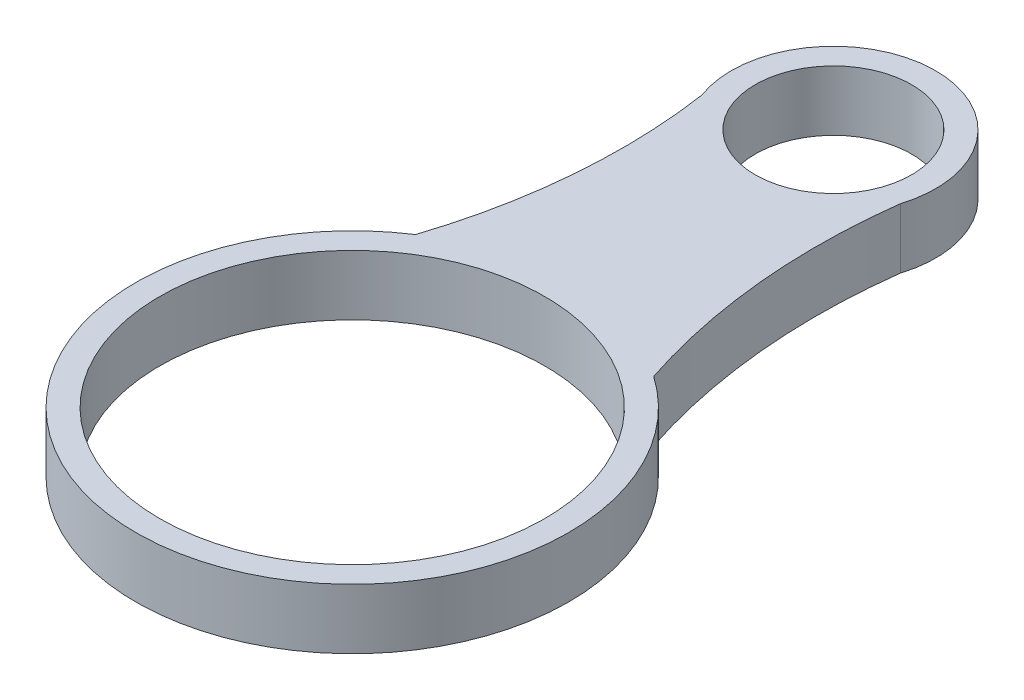
ISO-10303-21;
HEADER;
FILE_DESCRIPTION(('STEP AP214'),'2;1');
FILE_NAME('part.step','',(''),(''),'','','');
FILE_SCHEMA(('AUTOMOTIVE_DESIGN { 1 0 10303 214 1 1 1 1 }'));
ENDSEC;
DATA;
#1=APPLICATION_CONTEXT('core data for automotive mechanical design processes');
#2=APPLICATION_PROTOCOL_DEFINITION('international standard','automotive_design',2000,#1);
#3=PRODUCT_CONTEXT('',#1,'mechanical');
#4=PRODUCT('Part','Part','',(#3));
#5=PRODUCT_RELATED_PRODUCT_CATEGORY('part','',(#4));
#6=PRODUCT_DEFINITION_FORMATION('','',#4);
#7=PRODUCT_DEFINITION_CONTEXT('part definition',#1,'design');
#8=PRODUCT_DEFINITION('design','',#6,#7);
#9=PRODUCT_DEFINITION_SHAPE('','',#8);
#10=(LENGTH_UNIT() NAMED_UNIT(*) SI_UNIT(.MILLI.,.METRE.));
#11=(NAMED_UNIT(*) PLANE_ANGLE_UNIT() SI_UNIT($,.RADIAN.));
#12=(NAMED_UNIT(*) SI_UNIT($,.STERADIAN.) SOLID_ANGLE_UNIT());
#13=UNCERTAINTY_MEASURE_WITH_UNIT(LENGTH_MEASURE(1.E-05),#10,'distance_accuracy_value','');
#14=(GEOMETRIC_REPRESENTATION_CONTEXT(3) GLOBAL_UNCERTAINTY_ASSIGNED_CONTEXT((#13)) GLOBAL_UNIT_ASSIGNED_CONTEXT((#10,
#11,#12)) REPRESENTATION_CONTEXT('',''));
#15=CARTESIAN_POINT('',(0.,0.,0.));
#16=DIRECTION('',(0.,0.,1.));
#17=DIRECTION('',(1.,0.,0.));
#18=AXIS2_PLACEMENT_3D('',#15,#16,#17);
#19=CARTESIAN_POINT('',(-553.271398167684,50.,100.066792935175));
#20=DIRECTION('',(0.,-1.,0.));
#21=DIRECTION('',(0.,0.,-1.));
#22=AXIS2_PLACEMENT_3D('',#19,#20,#21);
#23=CYLINDRICAL_SURFACE('',#22,478.843884152496);
#24=CARTESIAN_POINT('',(-553.271398167684,0.,100.066792935175));
#25=DIRECTION('',(0.,1.,0.));
#26=DIRECTION('',(0.,0.,1.));
#27=AXIS2_PLACEMENT_3D('',#24,#25,#26);
#28=CIRCLE('',#27,478.843884152496);
#29=CARTESIAN_POINT('',(-98.2325288386791,0.,249.167741255532));
#30=VERTEX_POINT('',#29);
#31=CARTESIAN_POINT('',(-79.6151534194718,0.,29.7729297516046));
#32=VERTEX_POINT('',#31);
#33=EDGE_CURVE('E97',#30,#32,#28,.T.);
#34=ORIENTED_EDGE('',*,*,#33,.F.);
#35=DIRECTION('',(0.,-1.,0.));
#36=VECTOR('',#35,1.);
#37=CARTESIAN_POINT('',(-98.2325288386791,50.,249.167741255532));
#38=LINE('',#37,#36);
#39=CARTESIAN_POINT('',(-98.2325288386791,50.,249.167741255532));
#40=VERTEX_POINT('',#39);
#41=EDGE_CURVE('E11',#40,#30,#38,.T.);
#42=ORIENTED_EDGE('',*,*,#41,.F.);
#43=CARTESIAN_POINT('',(-553.271398167684,50.,100.066792935175));
#44=DIRECTION('',(0.,1.,0.));
#45=DIRECTION('',(0.,0.,1.));
#46=AXIS2_PLACEMENT_3D('',#43,#44,#45);
#47=CIRCLE('',#46,478.843884152496);
#48=CARTESIAN_POINT('',(-79.6151534194718,50.,29.7729297516046));
#49=VERTEX_POINT('',#48);
#50=EDGE_CURVE('E82',#40,#49,#47,.T.);
#51=ORIENTED_EDGE('',*,*,#50,.T.);
#52=DIRECTION('',(0.,-1.,0.));
#53=VECTOR('',#52,1.);
#54=CARTESIAN_POINT('',(-79.6151534194718,50.,29.7729297516046));
#55=LINE('',#54,#53);
#56=EDGE_CURVE('E72',#49,#32,#55,.T.);
#57=ORIENTED_EDGE('',*,*,#56,.T.);
#58=EDGE_LOOP('',(#34,#42,#51,#57));
#59=FACE_BOUND('',#58,.T.);
#60=ADVANCED_FACE('F34',(#59),#23,.F.);
#61=CARTESIAN_POINT('',(0.,50.,400.));
#62=DIRECTION('',(0.,-1.,0.));
#63=DIRECTION('',(0.,0.,-1.));
#64=AXIS2_PLACEMENT_3D('',#61,#62,#63);
#65=CYLINDRICAL_SURFACE('',#64,180.);
#66=CARTESIAN_POINT('',(0.,0.,400.));
#67=DIRECTION('',(0.,1.,0.));
#68=DIRECTION('',(0.,0.,1.));
#69=AXIS2_PLACEMENT_3D('',#66,#67,#68);
#70=CIRCLE('',#69,180.);
#71=CARTESIAN_POINT('',(102.857311412176,0.,252.282792170111));
#72=VERTEX_POINT('',#71);
#73=EDGE_CURVE('E88',#30,#72,#70,.T.);
#74=ORIENTED_EDGE('',*,*,#73,.T.);
#75=DIRECTION('',(0.,-1.,0.));
#76=VECTOR('',#75,1.);
#77=CARTESIAN_POINT('',(102.857311412176,50.,252.282792170111));
#78=LINE('',#77,#76);
#79=CARTESIAN_POINT('',(102.857311412176,50.,252.282792170111));
#80=VERTEX_POINT('',#79);
#81=EDGE_CURVE('E42',#80,#72,#78,.T.);
#82=ORIENTED_EDGE('',*,*,#81,.F.);
#83=CARTESIAN_POINT('',(0.,50.,400.));
#84=DIRECTION('',(0.,1.,0.));
#85=DIRECTION('',(0.,0.,1.));
#86=AXIS2_PLACEMENT_3D('',#83,#84,#85);
#87=CIRCLE('',#86,180.);
#88=EDGE_CURVE('E77',#40,#80,#87,.T.);
#89=ORIENTED_EDGE('',*,*,#88,.F.);
#90=ORIENTED_EDGE('',*,*,#41,.T.);
#91=EDGE_LOOP('',(#74,#82,#89,#90));
#92=FACE_BOUND('',#91,.T.);
#93=ADVANCED_FACE('F86',(#92),#65,.T.);
#94=CARTESIAN_POINT('',(591.893805117116,50.,90.8939712846849));
#95=DIRECTION('',(0.,-1.,0.));
#96=DIRECTION('',(0.,0.,-1.));
#97=AXIS2_PLACEMENT_3D('',#94,#95,#96);
#98=CYLINDRICAL_SURFACE('',#97,514.978682745228);
#99=CARTESIAN_POINT('',(591.893805117116,0.,90.8939712846849));
#100=DIRECTION('',(0.,1.,0.));
#101=DIRECTION('',(0.,0.,1.));
#102=AXIS2_PLACEMENT_3D('',#99,#100,#101);
#103=CIRCLE('',#102,514.978682745228);
#104=CARTESIAN_POINT('',(81.0834037375697,0.,25.5045415236241));
#105=VERTEX_POINT('',#104);
#106=EDGE_CURVE('E102',#105,#72,#103,.T.);
#107=ORIENTED_EDGE('',*,*,#106,.F.);
#108=DIRECTION('',(0.,-1.,0.));
#109=VECTOR('',#108,1.);
#110=CARTESIAN_POINT('',(81.0834037375697,50.,25.5045415236241));
#111=LINE('',#110,#109);
#112=CARTESIAN_POINT('',(81.0834037375697,50.,25.5045415236241));
#113=VERTEX_POINT('',#112);
#114=EDGE_CURVE('E65',#113,#105,#111,.T.);
#115=ORIENTED_EDGE('',*,*,#114,.F.);
#116=CARTESIAN_POINT('',(591.893805117116,50.,90.8939712846849));
#117=DIRECTION('',(0.,1.,0.));
#118=DIRECTION('',(0.,0.,1.));
#119=AXIS2_PLACEMENT_3D('',#116,#117,#118);
#120=CIRCLE('',#119,514.978682745228);
#121=EDGE_CURVE('E81',#113,#80,#120,.T.);
#122=ORIENTED_EDGE('',*,*,#121,.T.);
#123=ORIENTED_EDGE('',*,*,#81,.T.);
#124=EDGE_LOOP('',(#107,#115,#122,#123));
#125=FACE_BOUND('',#124,.T.);
#126=ADVANCED_FACE('F92',(#125),#98,.F.);
#127=CARTESIAN_POINT('',(0.,50.,0.));
#128=DIRECTION('',(0.,-1.,0.));
#129=DIRECTION('',(0.,0.,-1.));
#130=AXIS2_PLACEMENT_3D('',#127,#128,#129);
#131=CYLINDRICAL_SURFACE('',#130,85.);
#132=CARTESIAN_POINT('',(0.,0.,0.));
#133=DIRECTION('',(0.,1.,0.));
#134=DIRECTION('',(0.,0.,1.));
#135=AXIS2_PLACEMENT_3D('',#132,#133,#134);
#136=CIRCLE('',#135,85.);
#137=EDGE_CURVE('E104',#105,#32,#136,.T.);
#138=ORIENTED_EDGE('',*,*,#137,.T.);
#139=ORIENTED_EDGE('',*,*,#56,.F.);
#140=CARTESIAN_POINT('',(0.,50.,0.));
#141=DIRECTION('',(0.,1.,0.));
#142=DIRECTION('',(0.,0.,1.));
#143=AXIS2_PLACEMENT_3D('',#140,#141,#142);
#144=CIRCLE('',#143,85.);
#145=EDGE_CURVE('E50',#113,#49,#144,.T.);
#146=ORIENTED_EDGE('',*,*,#145,.F.);
#147=ORIENTED_EDGE('',*,*,#114,.T.);
#148=EDGE_LOOP('',(#138,#139,#146,#147));
#149=FACE_BOUND('',#148,.T.);
#150=ADVANCED_FACE('F132',(#149),#131,.T.);
#151=CARTESIAN_POINT('',(0.,50.,0.));
#152=DIRECTION('',(0.,1.,0.));
#153=DIRECTION('',(0.,0.,1.));
#154=AXIS2_PLACEMENT_3D('',#151,#152,#153);
#155=PLANE('',#154);
#156=CARTESIAN_POINT('',(0.,50.,400.000000000001));
#157=DIRECTION('',(0.,1.,0.));
#158=DIRECTION('',(0.,0.,1.));
#159=AXIS2_PLACEMENT_3D('',#156,#157,#158);
#160=CIRCLE('',#159,160.);
#161=CARTESIAN_POINT('',(0.,50.,560.000000000001));
#162=VERTEX_POINT('',#161);
#163=EDGE_CURVE('E114',#162,#162,#160,.T.);
#164=ORIENTED_EDGE('',*,*,#163,.F.);
#165=EDGE_LOOP('',(#164));
#166=FACE_BOUND('',#165,.T.);
#167=CARTESIAN_POINT('',(0.,50.,0.));
#168=DIRECTION('',(0.,1.,0.));
#169=DIRECTION('',(0.,0.,1.));
#170=AXIS2_PLACEMENT_3D('',#167,#168,#169);
#171=CIRCLE('',#170,65.);
#172=CARTESIAN_POINT('',(0.,50.,65.));
#173=VERTEX_POINT('',#172);
#174=EDGE_CURVE('E108',#173,#173,#171,.T.);
#175=ORIENTED_EDGE('',*,*,#174,.F.);
#176=EDGE_LOOP('',(#175));
#177=FACE_BOUND('',#176,.T.);
#178=ORIENTED_EDGE('',*,*,#50,.F.);
#179=ORIENTED_EDGE('',*,*,#88,.T.);
#180=ORIENTED_EDGE('',*,*,#121,.F.);
#181=ORIENTED_EDGE('',*,*,#145,.T.);
#182=EDGE_LOOP('',(#178,#179,#180,#181));
#183=FACE_BOUND('',#182,.T.);
#184=ADVANCED_FACE('F79',(#166,#177,#183),#155,.T.);
#185=CARTESIAN_POINT('',(0.,0.,0.));
#186=DIRECTION('',(0.,1.,0.));
#187=DIRECTION('',(0.,0.,1.));
#188=AXIS2_PLACEMENT_3D('',#185,#186,#187);
#189=PLANE('',#188);
#190=CARTESIAN_POINT('',(0.,0.,400.000000000001));
#191=DIRECTION('',(0.,1.,0.));
#192=DIRECTION('',(0.,0.,1.));
#193=AXIS2_PLACEMENT_3D('',#190,#191,#192);
#194=CIRCLE('',#193,160.);
#195=CARTESIAN_POINT('',(0.,0.,560.000000000001));
#196=VERTEX_POINT('',#195);
#197=EDGE_CURVE('E111',#196,#196,#194,.T.);
#198=ORIENTED_EDGE('',*,*,#197,.T.);
#199=EDGE_LOOP('',(#198));
#200=FACE_BOUND('',#199,.T.);
#201=CARTESIAN_POINT('',(0.,0.,0.));
#202=DIRECTION('',(0.,1.,0.));
#203=DIRECTION('',(0.,0.,1.));
#204=AXIS2_PLACEMENT_3D('',#201,#202,#203);
#205=CIRCLE('',#204,65.);
#206=CARTESIAN_POINT('',(0.,0.,65.));
#207=VERTEX_POINT('',#206);
#208=EDGE_CURVE('E100',#207,#207,#205,.T.);
#209=ORIENTED_EDGE('',*,*,#208,.T.);
#210=EDGE_LOOP('',(#209));
#211=FACE_BOUND('',#210,.T.);
#212=ORIENTED_EDGE('',*,*,#33,.T.);
#213=ORIENTED_EDGE('',*,*,#137,.F.);
#214=ORIENTED_EDGE('',*,*,#106,.T.);
#215=ORIENTED_EDGE('',*,*,#73,.F.);
#216=EDGE_LOOP('',(#212,#213,#214,#215));
#217=FACE_BOUND('',#216,.T.);
#218=ADVANCED_FACE('F120',(#200,#211,#217),#189,.F.);
#219=CARTESIAN_POINT('',(0.,0.,0.));
#220=DIRECTION('',(0.,1.,0.));
#221=DIRECTION('',(0.,0.,1.));
#222=AXIS2_PLACEMENT_3D('',#219,#220,#221);
#223=CYLINDRICAL_SURFACE('',#222,65.);
#224=ORIENTED_EDGE('',*,*,#208,.F.);
#225=EDGE_LOOP('',(#224));
#226=FACE_BOUND('',#225,.T.);
#227=ORIENTED_EDGE('',*,*,#174,.T.);
#228=EDGE_LOOP('',(#227));
#229=FACE_BOUND('',#228,.T.);
#230=ADVANCED_FACE('F126',(#226,#229),#223,.F.);
#231=CARTESIAN_POINT('',(0.,0.,400.000000000001));
#232=DIRECTION('',(0.,1.,0.));
#233=DIRECTION('',(0.,0.,1.));
#234=AXIS2_PLACEMENT_3D('',#231,#232,#233);
#235=CYLINDRICAL_SURFACE('',#234,160.);
#236=ORIENTED_EDGE('',*,*,#197,.F.);
#237=EDGE_LOOP('',(#236));
#238=FACE_BOUND('',#237,.T.);
#239=ORIENTED_EDGE('',*,*,#163,.T.);
#240=EDGE_LOOP('',(#239));
#241=FACE_BOUND('',#240,.T.);
#242=ADVANCED_FACE('F123',(#238,#241),#235,.F.);
#243=CLOSED_SHELL('',(#60,#93,#126,#150,#184,#218,#230,#242));
#244=MANIFOLD_SOLID_BREP('B2',#243);
#245=ADVANCED_BREP_SHAPE_REPRESENTATION('',(#18,#244),#14);
#246=SHAPE_DEFINITION_REPRESENTATION(#9,#245);
ENDSEC;
END-ISO-10303-21;
